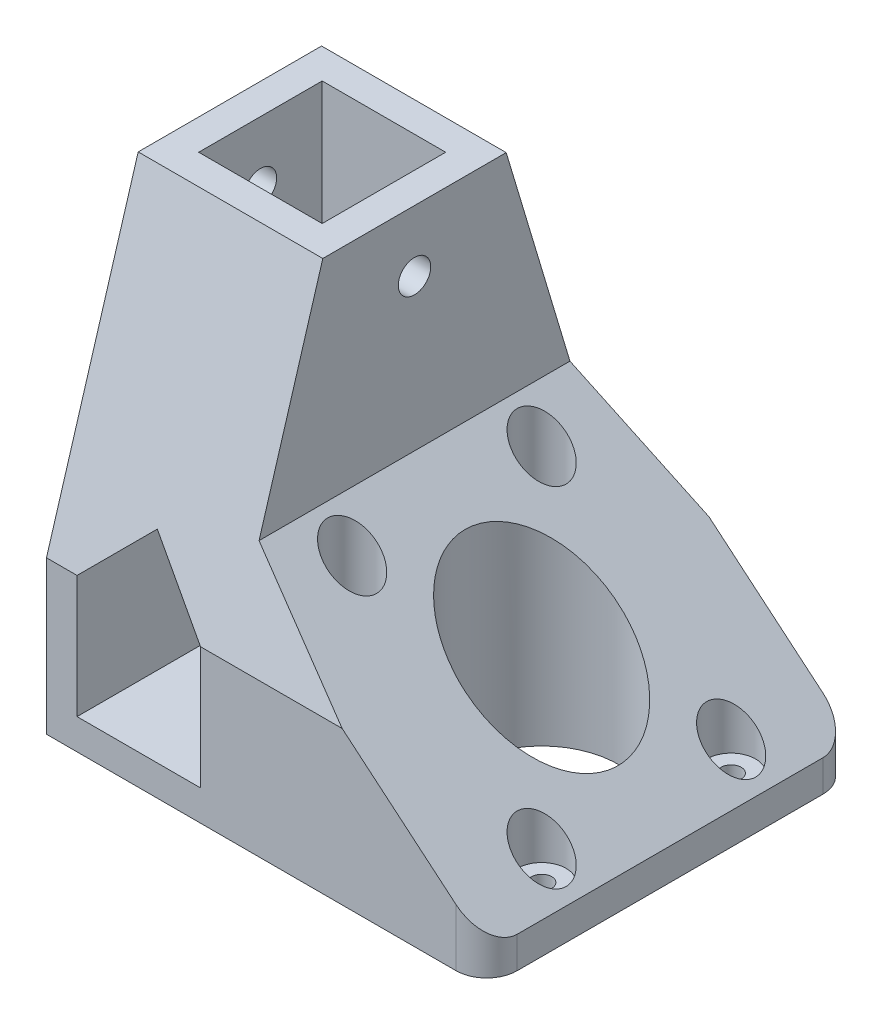
ISO-10303-21;
HEADER;
FILE_DESCRIPTION(('STEP AP214'),'2;1');
FILE_NAME('part.step','',(''),(''),'','','');
FILE_SCHEMA(('AUTOMOTIVE_DESIGN { 1 0 10303 214 1 1 1 1 }'));
ENDSEC;
DATA;
#1=APPLICATION_CONTEXT('core data for automotive mechanical design processes');
#2=APPLICATION_PROTOCOL_DEFINITION('international standard','automotive_design',2000,#1);
#3=PRODUCT_CONTEXT('',#1,'mechanical');
#4=PRODUCT('Part','Part','',(#3));
#5=PRODUCT_RELATED_PRODUCT_CATEGORY('part','',(#4));
#6=PRODUCT_DEFINITION_FORMATION('','',#4);
#7=PRODUCT_DEFINITION_CONTEXT('part definition',#1,'design');
#8=PRODUCT_DEFINITION('design','',#6,#7);
#9=PRODUCT_DEFINITION_SHAPE('','',#8);
#10=(LENGTH_UNIT() NAMED_UNIT(*) SI_UNIT(.MILLI.,.METRE.));
#11=(NAMED_UNIT(*) PLANE_ANGLE_UNIT() SI_UNIT($,.RADIAN.));
#12=(NAMED_UNIT(*) SI_UNIT($,.STERADIAN.) SOLID_ANGLE_UNIT());
#13=UNCERTAINTY_MEASURE_WITH_UNIT(LENGTH_MEASURE(1.E-05),#10,'distance_accuracy_value','');
#14=(GEOMETRIC_REPRESENTATION_CONTEXT(3) GLOBAL_UNCERTAINTY_ASSIGNED_CONTEXT((#13)) GLOBAL_UNIT_ASSIGNED_CONTEXT((#10,
#11,#12)) REPRESENTATION_CONTEXT('',''));
#15=CARTESIAN_POINT('',(0.,0.,0.));
#16=DIRECTION('',(0.,0.,1.));
#17=DIRECTION('',(1.,0.,0.));
#18=AXIS2_PLACEMENT_3D('',#15,#16,#17);
#19=CARTESIAN_POINT('',(66.5,75.,-14.5));
#20=DIRECTION('',(0.,-1.,0.));
#21=DIRECTION('',(0.,0.,-1.));
#22=AXIS2_PLACEMENT_3D('',#19,#20,#21);
#23=CYLINDRICAL_SURFACE('',#22,1.65);
#24=CARTESIAN_POINT('',(66.5,0.,-14.5));
#25=DIRECTION('',(0.,-1.,0.));
#26=DIRECTION('',(0.,0.,-1.));
#27=AXIS2_PLACEMENT_3D('',#24,#25,#26);
#28=CIRCLE('',#27,1.65);
#29=CARTESIAN_POINT('',(66.5,0.,-16.15));
#30=VERTEX_POINT('',#29);
#31=EDGE_CURVE('E526',#30,#30,#28,.T.);
#32=ORIENTED_EDGE('',*,*,#31,.T.);
#33=EDGE_LOOP('',(#32));
#34=FACE_BOUND('',#33,.T.);
#35=CARTESIAN_POINT('',(66.5,5.,-14.5));
#36=DIRECTION('',(0.,1.,0.));
#37=DIRECTION('',(0.,0.,1.));
#38=AXIS2_PLACEMENT_3D('',#35,#36,#37);
#39=CIRCLE('',#38,1.65);
#40=CARTESIAN_POINT('',(66.5,5.,-12.85));
#41=VERTEX_POINT('',#40);
#42=EDGE_CURVE('E391',#41,#41,#39,.F.);
#43=ORIENTED_EDGE('',*,*,#42,.F.);
#44=EDGE_LOOP('',(#43));
#45=FACE_BOUND('',#44,.T.);
#46=ADVANCED_FACE('F40',(#34,#45),#23,.F.);
#47=CARTESIAN_POINT('',(66.5,75.,-45.5));
#48=DIRECTION('',(0.,-1.,0.));
#49=DIRECTION('',(0.,0.,-1.));
#50=AXIS2_PLACEMENT_3D('',#47,#48,#49);
#51=CYLINDRICAL_SURFACE('',#50,1.65);
#52=CARTESIAN_POINT('',(66.5,0.,-45.5));
#53=DIRECTION('',(0.,-1.,0.));
#54=DIRECTION('',(0.,0.,-1.));
#55=AXIS2_PLACEMENT_3D('',#52,#53,#54);
#56=CIRCLE('',#55,1.65);
#57=CARTESIAN_POINT('',(66.5,0.,-47.15));
#58=VERTEX_POINT('',#57);
#59=EDGE_CURVE('E530',#58,#58,#56,.T.);
#60=ORIENTED_EDGE('',*,*,#59,.T.);
#61=EDGE_LOOP('',(#60));
#62=FACE_BOUND('',#61,.T.);
#63=CARTESIAN_POINT('',(66.5,5.,-45.5));
#64=DIRECTION('',(0.,1.,0.));
#65=DIRECTION('',(0.,0.,1.));
#66=AXIS2_PLACEMENT_3D('',#63,#64,#65);
#67=CIRCLE('',#66,1.65);
#68=CARTESIAN_POINT('',(66.5,5.,-43.85));
#69=VERTEX_POINT('',#68);
#70=EDGE_CURVE('E387',#69,#69,#67,.F.);
#71=ORIENTED_EDGE('',*,*,#70,.F.);
#72=EDGE_LOOP('',(#71));
#73=FACE_BOUND('',#72,.T.);
#74=ADVANCED_FACE('F588',(#62,#73),#51,.F.);
#75=CARTESIAN_POINT('',(35.5,75.,-45.5));
#76=DIRECTION('',(0.,-1.,0.));
#77=DIRECTION('',(0.,0.,-1.));
#78=AXIS2_PLACEMENT_3D('',#75,#76,#77);
#79=CYLINDRICAL_SURFACE('',#78,1.65);
#80=CARTESIAN_POINT('',(35.5,0.,-45.5));
#81=DIRECTION('',(0.,-1.,0.));
#82=DIRECTION('',(0.,0.,-1.));
#83=AXIS2_PLACEMENT_3D('',#80,#81,#82);
#84=CIRCLE('',#83,1.65);
#85=CARTESIAN_POINT('',(35.5,0.,-47.15));
#86=VERTEX_POINT('',#85);
#87=EDGE_CURVE('E534',#86,#86,#84,.T.);
#88=ORIENTED_EDGE('',*,*,#87,.T.);
#89=EDGE_LOOP('',(#88));
#90=FACE_BOUND('',#89,.T.);
#91=CARTESIAN_POINT('',(35.5,5.,-45.5));
#92=DIRECTION('',(0.,1.,0.));
#93=DIRECTION('',(0.,0.,1.));
#94=AXIS2_PLACEMENT_3D('',#91,#92,#93);
#95=CIRCLE('',#94,1.65);
#96=CARTESIAN_POINT('',(35.5,5.,-43.85));
#97=VERTEX_POINT('',#96);
#98=EDGE_CURVE('E382',#97,#97,#95,.F.);
#99=ORIENTED_EDGE('',*,*,#98,.F.);
#100=EDGE_LOOP('',(#99));
#101=FACE_BOUND('',#100,.T.);
#102=ADVANCED_FACE('F594',(#90,#101),#79,.F.);
#103=CARTESIAN_POINT('',(35.5,75.,-14.5));
#104=DIRECTION('',(0.,-1.,0.));
#105=DIRECTION('',(0.,0.,-1.));
#106=AXIS2_PLACEMENT_3D('',#103,#104,#105);
#107=CYLINDRICAL_SURFACE('',#106,1.65);
#108=CARTESIAN_POINT('',(35.5,0.,-14.5));
#109=DIRECTION('',(0.,-1.,0.));
#110=DIRECTION('',(0.,0.,-1.));
#111=AXIS2_PLACEMENT_3D('',#108,#109,#110);
#112=CIRCLE('',#111,1.65);
#113=CARTESIAN_POINT('',(35.5,0.,-16.15));
#114=VERTEX_POINT('',#113);
#115=EDGE_CURVE('E411',#114,#114,#112,.T.);
#116=ORIENTED_EDGE('',*,*,#115,.T.);
#117=EDGE_LOOP('',(#116));
#118=FACE_BOUND('',#117,.T.);
#119=CARTESIAN_POINT('',(35.5,5.,-14.5));
#120=DIRECTION('',(0.,1.,0.));
#121=DIRECTION('',(0.,0.,1.));
#122=AXIS2_PLACEMENT_3D('',#119,#120,#121);
#123=CIRCLE('',#122,1.65);
#124=CARTESIAN_POINT('',(35.5,5.,-12.85));
#125=VERTEX_POINT('',#124);
#126=EDGE_CURVE('E378',#125,#125,#123,.F.);
#127=ORIENTED_EDGE('',*,*,#126,.F.);
#128=EDGE_LOOP('',(#127));
#129=FACE_BOUND('',#128,.T.);
#130=ADVANCED_FACE('F600',(#118,#129),#107,.F.);
#131=CARTESIAN_POINT('',(15.1,35.1000000000001,53.9262459290465));
#132=DIRECTION('',(0.707106781186551,-0.707106781186544,0.));
#133=DIRECTION('',(0.707106781186544,0.707106781186551,0.));
#134=AXIS2_PLACEMENT_3D('',#131,#132,#133);
#135=PLANE('',#134);
#136=DIRECTION('',(-0.707106781186544,-0.707106781186551,0.));
#137=VECTOR('',#136,1.);
#138=CARTESIAN_POINT('',(15.1,35.1000000000001,-19.9));
#139=LINE('',#138,#137);
#140=CARTESIAN_POINT('',(15.1,35.1000000000001,-19.9));
#141=VERTEX_POINT('',#140);
#142=CARTESIAN_POINT('',(5.,25.,-19.9));
#143=VERTEX_POINT('',#142);
#144=EDGE_CURVE('E224',#141,#143,#139,.T.);
#145=ORIENTED_EDGE('',*,*,#144,.F.);
#146=DIRECTION('',(0.,0.,-1.));
#147=VECTOR('',#146,1.);
#148=CARTESIAN_POINT('',(15.1,35.1000000000001,53.9262459290465));
#149=LINE('',#148,#147);
#150=CARTESIAN_POINT('',(15.1,35.1000000000001,-3.03014521594729));
#151=VERTEX_POINT('',#150);
#152=EDGE_CURVE('E233',#151,#141,#149,.T.);
#153=ORIENTED_EDGE('',*,*,#152,.F.);
#154=DIRECTION('',(-0.691713036274989,-0.691713036274996,0.207523856205644));
#155=VECTOR('',#154,1.);
#156=CARTESIAN_POINT('',(6.92408338791671,26.9240833879167,-0.577252680493051));
#157=LINE('',#156,#155);
#158=CARTESIAN_POINT('',(5.,25.,0.));
#159=VERTEX_POINT('',#158);
#160=EDGE_CURVE('E333',#151,#159,#157,.T.);
#161=ORIENTED_EDGE('',*,*,#160,.T.);
#162=DIRECTION('',(0.,0.,-1.));
#163=VECTOR('',#162,1.);
#164=CARTESIAN_POINT('',(5.,25.,53.9262459290465));
#165=LINE('',#164,#163);
#166=EDGE_CURVE('E228',#159,#143,#165,.T.);
#167=ORIENTED_EDGE('',*,*,#166,.T.);
#168=EDGE_LOOP('',(#145,#153,#161,#167));
#169=FACE_BOUND('',#168,.T.);
#170=ADVANCED_FACE('F517',(#169),#135,.T.);
#171=CARTESIAN_POINT('',(25.2,25.,53.9262459290465));
#172=DIRECTION('',(-0.707106781186551,-0.707106781186544,0.));
#173=DIRECTION('',(0.707106781186544,-0.707106781186551,0.));
#174=AXIS2_PLACEMENT_3D('',#171,#172,#173);
#175=PLANE('',#174);
#176=DIRECTION('',(-0.707106781186544,0.707106781186551,0.));
#177=VECTOR('',#176,1.);
#178=CARTESIAN_POINT('',(25.2,25.,-19.9));
#179=LINE('',#178,#177);
#180=CARTESIAN_POINT('',(25.2,25.,-19.9));
#181=VERTEX_POINT('',#180);
#182=EDGE_CURVE('E369',#181,#141,#179,.T.);
#183=ORIENTED_EDGE('',*,*,#182,.F.);
#184=DIRECTION('',(0.,0.,-1.));
#185=VECTOR('',#184,1.);
#186=CARTESIAN_POINT('',(25.2,25.,53.9262459290465));
#187=LINE('',#186,#185);
#188=CARTESIAN_POINT('',(25.2,25.,0.));
#189=VERTEX_POINT('',#188);
#190=EDGE_CURVE('E238',#189,#181,#187,.T.);
#191=ORIENTED_EDGE('',*,*,#190,.F.);
#192=DIRECTION('',(-0.691713036274989,0.691713036274997,-0.207523856205645));
#193=VECTOR('',#192,1.);
#194=CARTESIAN_POINT('',(32.9409484880492,17.2590515119507,2.32239584435209));
#195=LINE('',#194,#193);
#196=EDGE_CURVE('E340',#189,#151,#195,.T.);
#197=ORIENTED_EDGE('',*,*,#196,.T.);
#198=ORIENTED_EDGE('',*,*,#152,.T.);
#199=EDGE_LOOP('',(#183,#191,#197,#198));
#200=FACE_BOUND('',#199,.T.);
#201=ADVANCED_FACE('F514',(#200),#175,.T.);
#202=CARTESIAN_POINT('',(0.,5.,0.));
#203=DIRECTION('',(0.,-1.,0.));
#204=DIRECTION('',(0.,0.,-1.));
#205=AXIS2_PLACEMENT_3D('',#202,#203,#204);
#206=PLANE('',#205);
#207=CARTESIAN_POINT('',(15.,5.,-30.));
#208=DIRECTION('',(0.,-1.,0.));
#209=DIRECTION('',(0.,0.,-1.));
#210=AXIS2_PLACEMENT_3D('',#207,#208,#209);
#211=CIRCLE('',#210,2.65);
#212=CARTESIAN_POINT('',(15.,5.,-32.65));
#213=VERTEX_POINT('',#212);
#214=EDGE_CURVE('E422',#213,#213,#211,.T.);
#215=ORIENTED_EDGE('',*,*,#214,.T.);
#216=EDGE_LOOP('',(#215));
#217=FACE_BOUND('',#216,.T.);
#218=DIRECTION('',(0.,0.,1.));
#219=VECTOR('',#218,1.);
#220=CARTESIAN_POINT('',(25.2,5.,-60.));
#221=LINE('',#220,#219);
#222=CARTESIAN_POINT('',(25.2,5.,-60.));
#223=VERTEX_POINT('',#222);
#224=CARTESIAN_POINT('',(25.2,5.,0.));
#225=VERTEX_POINT('',#224);
#226=EDGE_CURVE('E232',#223,#225,#221,.T.);
#227=ORIENTED_EDGE('',*,*,#226,.F.);
#228=DIRECTION('',(-1.,0.,0.));
#229=VECTOR('',#228,1.);
#230=CARTESIAN_POINT('',(0.,5.,-60.));
#231=LINE('',#230,#229);
#232=CARTESIAN_POINT('',(5.,5.,-60.));
#233=VERTEX_POINT('',#232);
#234=EDGE_CURVE('E274',#223,#233,#231,.T.);
#235=ORIENTED_EDGE('',*,*,#234,.T.);
#236=DIRECTION('',(0.,0.,-1.));
#237=VECTOR('',#236,1.);
#238=CARTESIAN_POINT('',(5.,5.,-60.));
#239=LINE('',#238,#237);
#240=CARTESIAN_POINT('',(4.99999999999999,5.,0.));
#241=VERTEX_POINT('',#240);
#242=EDGE_CURVE('E255',#241,#233,#239,.T.);
#243=ORIENTED_EDGE('',*,*,#242,.F.);
#244=DIRECTION('',(1.,0.,0.));
#245=VECTOR('',#244,1.);
#246=CARTESIAN_POINT('',(0.,5.,0.));
#247=LINE('',#246,#245);
#248=EDGE_CURVE('E270',#241,#225,#247,.T.);
#249=ORIENTED_EDGE('',*,*,#248,.T.);
#250=EDGE_LOOP('',(#227,#235,#243,#249));
#251=FACE_BOUND('',#250,.T.);
#252=ADVANCED_FACE('F506',(#217,#251),#206,.F.);
#253=CARTESIAN_POINT('',(0.,5.,0.));
#254=DIRECTION('',(1.,0.,0.));
#255=DIRECTION('',(0.,0.,-1.));
#256=AXIS2_PLACEMENT_3D('',#253,#254,#255);
#257=PLANE('',#256);
#258=CARTESIAN_POINT('',(0.,15.,-30.));
#259=DIRECTION('',(-1.,0.,0.));
#260=DIRECTION('',(0.,0.,1.));
#261=AXIS2_PLACEMENT_3D('',#258,#259,#260);
#262=CIRCLE('',#261,2.65);
#263=CARTESIAN_POINT('',(0.,15.,-27.35));
#264=VERTEX_POINT('',#263);
#265=EDGE_CURVE('E569',#264,#264,#262,.T.);
#266=ORIENTED_EDGE('',*,*,#265,.F.);
#267=EDGE_LOOP('',(#266));
#268=FACE_BOUND('',#267,.T.);
#269=CARTESIAN_POINT('',(0.,65.,-30.));
#270=DIRECTION('',(1.,0.,0.));
#271=DIRECTION('',(0.,0.,-1.));
#272=AXIS2_PLACEMENT_3D('',#269,#270,#271);
#273=CIRCLE('',#272,2.65);
#274=CARTESIAN_POINT('',(0.,65.,-32.65));
#275=VERTEX_POINT('',#274);
#276=EDGE_CURVE('E417',#275,#275,#273,.T.);
#277=ORIENTED_EDGE('',*,*,#276,.T.);
#278=EDGE_LOOP('',(#277));
#279=FACE_BOUND('',#278,.T.);
#280=DIRECTION('',(0.,0.,1.));
#281=VECTOR('',#280,1.);
#282=CARTESIAN_POINT('',(0.,75.,-60.));
#283=LINE('',#282,#281);
#284=CARTESIAN_POINT('',(0.,75.,-44.9992811091721));
#285=VERTEX_POINT('',#284);
#286=CARTESIAN_POINT('',(0.,75.,-15.0007188908279));
#287=VERTEX_POINT('',#286);
#288=EDGE_CURVE('E256',#285,#287,#283,.T.);
#289=ORIENTED_EDGE('',*,*,#288,.F.);
#290=DIRECTION('',(0.,-0.957822494845313,-0.287360519849719));
#291=VECTOR('',#290,1.);
#292=CARTESIAN_POINT('',(0.,75.,-44.9992811091721));
#293=LINE('',#292,#291);
#294=CARTESIAN_POINT('',(0.,24.9999999999999,-60.));
#295=VERTEX_POINT('',#294);
#296=EDGE_CURVE('E323',#285,#295,#293,.T.);
#297=ORIENTED_EDGE('',*,*,#296,.T.);
#298=DIRECTION('',(0.,-1.,0.));
#299=VECTOR('',#298,1.);
#300=CARTESIAN_POINT('',(0.,5.,-60.));
#301=LINE('',#300,#299);
#302=CARTESIAN_POINT('',(0.,0.,-60.));
#303=VERTEX_POINT('',#302);
#304=EDGE_CURVE('E279',#295,#303,#301,.T.);
#305=ORIENTED_EDGE('',*,*,#304,.T.);
#306=DIRECTION('',(0.,0.,1.));
#307=VECTOR('',#306,1.);
#308=CARTESIAN_POINT('',(0.,0.,0.));
#309=LINE('',#308,#307);
#310=CARTESIAN_POINT('',(0.,0.,0.));
#311=VERTEX_POINT('',#310);
#312=EDGE_CURVE('E269',#303,#311,#309,.T.);
#313=ORIENTED_EDGE('',*,*,#312,.T.);
#314=DIRECTION('',(0.,-1.,0.));
#315=VECTOR('',#314,1.);
#316=CARTESIAN_POINT('',(0.,5.,0.));
#317=LINE('',#316,#315);
#318=CARTESIAN_POINT('',(0.,24.9999999999999,0.));
#319=VERTEX_POINT('',#318);
#320=EDGE_CURVE('E295',#319,#311,#317,.T.);
#321=ORIENTED_EDGE('',*,*,#320,.F.);
#322=DIRECTION('',(0.,0.957822494845313,-0.287360519849719));
#323=VECTOR('',#322,1.);
#324=CARTESIAN_POINT('',(0.,75.,-15.0007188908279));
#325=LINE('',#324,#323);
#326=EDGE_CURVE('E320',#319,#287,#325,.T.);
#327=ORIENTED_EDGE('',*,*,#326,.T.);
#328=EDGE_LOOP('',(#289,#297,#305,#313,#321,#327));
#329=FACE_BOUND('',#328,.T.);
#330=ADVANCED_FACE('F471',(#268,#279,#329),#257,.F.);
#331=CARTESIAN_POINT('',(0.,5.,0.));
#332=DIRECTION('',(0.,0.,-1.));
#333=DIRECTION('',(-1.,0.,0.));
#334=AXIS2_PLACEMENT_3D('',#331,#332,#333);
#335=PLANE('',#334);
#336=DIRECTION('',(1.,0.,0.));
#337=VECTOR('',#336,1.);
#338=CARTESIAN_POINT('',(0.,0.,0.));
#339=LINE('',#338,#337);
#340=CARTESIAN_POINT('',(67.,0.,0.));
#341=VERTEX_POINT('',#340);
#342=EDGE_CURVE('E283',#311,#341,#339,.T.);
#343=ORIENTED_EDGE('',*,*,#342,.T.);
#344=DIRECTION('',(0.,-1.,0.));
#345=VECTOR('',#344,1.);
#346=CARTESIAN_POINT('',(67.,5.,0.));
#347=LINE('',#346,#345);
#348=CARTESIAN_POINT('',(67.,9.36331808212209,0.));
#349=VERTEX_POINT('',#348);
#350=EDGE_CURVE('E12',#341,#349,#347,.F.);
#351=ORIENTED_EDGE('',*,*,#350,.T.);
#352=DIRECTION('',(0.766044443118974,-0.642787609686544,0.));
#353=VECTOR('',#352,1.);
#354=CARTESIAN_POINT('',(29.8313007862243,40.5515598837409,0.));
#355=LINE('',#354,#353);
#356=CARTESIAN_POINT('',(48.3649281481164,24.9999999999999,0.));
#357=VERTEX_POINT('',#356);
#358=EDGE_CURVE('E309',#349,#357,#355,.F.);
#359=ORIENTED_EDGE('',*,*,#358,.T.);
#360=DIRECTION('',(-1.,0.,0.));
#361=VECTOR('',#360,1.);
#362=CARTESIAN_POINT('',(0.,24.9999999999999,0.));
#363=LINE('',#362,#361);
#364=EDGE_CURVE('E363',#357,#189,#363,.T.);
#365=ORIENTED_EDGE('',*,*,#364,.T.);
#366=DIRECTION('',(0.,-1.,0.));
#367=VECTOR('',#366,1.);
#368=CARTESIAN_POINT('',(25.2,75.,0.));
#369=LINE('',#368,#367);
#370=EDGE_CURVE('E252',#189,#225,#369,.T.);
#371=ORIENTED_EDGE('',*,*,#370,.T.);
#372=ORIENTED_EDGE('',*,*,#248,.F.);
#373=DIRECTION('',(0.,-1.,0.));
#374=VECTOR('',#373,1.);
#375=CARTESIAN_POINT('',(4.99999999999998,75.,0.));
#376=LINE('',#375,#374);
#377=EDGE_CURVE('E266',#159,#241,#376,.T.);
#378=ORIENTED_EDGE('',*,*,#377,.F.);
#379=DIRECTION('',(-1.,0.,0.));
#380=VECTOR('',#379,1.);
#381=CARTESIAN_POINT('',(0.,24.9999999999999,0.));
#382=LINE('',#381,#380);
#383=EDGE_CURVE('E360',#159,#319,#382,.T.);
#384=ORIENTED_EDGE('',*,*,#383,.T.);
#385=ORIENTED_EDGE('',*,*,#320,.T.);
#386=EDGE_LOOP('',(#343,#351,#359,#365,#371,#372,#378,#384,#385));
#387=FACE_BOUND('',#386,.T.);
#388=ADVANCED_FACE('F464',(#387),#335,.F.);
#389=CARTESIAN_POINT('',(72.,5.,0.));
#390=DIRECTION('',(-1.,0.,0.));
#391=DIRECTION('',(0.,0.,1.));
#392=AXIS2_PLACEMENT_3D('',#389,#390,#391);
#393=PLANE('',#392);
#394=DIRECTION('',(0.,0.,-1.));
#395=VECTOR('',#394,1.);
#396=CARTESIAN_POINT('',(72.,0.,0.));
#397=LINE('',#396,#395);
#398=CARTESIAN_POINT('',(72.,0.,-5.));
#399=VERTEX_POINT('',#398);
#400=CARTESIAN_POINT('',(72.,0.,-55.));
#401=VERTEX_POINT('',#400);
#402=EDGE_CURVE('E286',#399,#401,#397,.T.);
#403=ORIENTED_EDGE('',*,*,#402,.T.);
#404=DIRECTION('',(0.,-1.,0.));
#405=VECTOR('',#404,1.);
#406=CARTESIAN_POINT('',(72.,5.,-55.));
#407=LINE('',#406,#405);
#408=CARTESIAN_POINT('',(72.,5.16781992623565,-55.));
#409=VERTEX_POINT('',#408);
#410=EDGE_CURVE('E436',#401,#409,#407,.F.);
#411=ORIENTED_EDGE('',*,*,#410,.T.);
#412=DIRECTION('',(0.,0.,-1.));
#413=VECTOR('',#412,1.);
#414=CARTESIAN_POINT('',(72.,5.16781992623564,0.));
#415=LINE('',#414,#413);
#416=CARTESIAN_POINT('',(72.,5.16781992623564,-5.));
#417=VERTEX_POINT('',#416);
#418=EDGE_CURVE('E306',#409,#417,#415,.F.);
#419=ORIENTED_EDGE('',*,*,#418,.T.);
#420=DIRECTION('',(0.,-1.,0.));
#421=VECTOR('',#420,1.);
#422=CARTESIAN_POINT('',(72.,5.,-5.));
#423=LINE('',#422,#421);
#424=EDGE_CURVE('E432',#417,#399,#423,.T.);
#425=ORIENTED_EDGE('',*,*,#424,.T.);
#426=EDGE_LOOP('',(#403,#411,#419,#425));
#427=FACE_BOUND('',#426,.T.);
#428=ADVANCED_FACE('F460',(#427),#393,.F.);
#429=CARTESIAN_POINT('',(0.,5.,-60.));
#430=DIRECTION('',(0.,0.,1.));
#431=DIRECTION('',(1.,0.,0.));
#432=AXIS2_PLACEMENT_3D('',#429,#430,#431);
#433=PLANE('',#432);
#434=DIRECTION('',(-0.766044443118974,0.642787609686544,0.));
#435=VECTOR('',#434,1.);
#436=CARTESIAN_POINT('',(29.8313007862243,40.5515598837409,-60.));
#437=LINE('',#436,#435);
#438=CARTESIAN_POINT('',(48.3649281481164,24.9999999999999,-60.));
#439=VERTEX_POINT('',#438);
#440=CARTESIAN_POINT('',(67.,9.36331808212211,-60.));
#441=VERTEX_POINT('',#440);
#442=EDGE_CURVE('E302',#439,#441,#437,.F.);
#443=ORIENTED_EDGE('',*,*,#442,.T.);
#444=DIRECTION('',(0.,-1.,0.));
#445=VECTOR('',#444,1.);
#446=CARTESIAN_POINT('',(67.,5.,-60.));
#447=LINE('',#446,#445);
#448=CARTESIAN_POINT('',(67.,0.,-60.));
#449=VERTEX_POINT('',#448);
#450=EDGE_CURVE('E372',#441,#449,#447,.T.);
#451=ORIENTED_EDGE('',*,*,#450,.T.);
#452=DIRECTION('',(-1.,0.,0.));
#453=VECTOR('',#452,1.);
#454=CARTESIAN_POINT('',(0.,0.,-60.));
#455=LINE('',#454,#453);
#456=EDGE_CURVE('E275',#449,#303,#455,.T.);
#457=ORIENTED_EDGE('',*,*,#456,.T.);
#458=ORIENTED_EDGE('',*,*,#304,.F.);
#459=DIRECTION('',(1.,0.,0.));
#460=VECTOR('',#459,1.);
#461=CARTESIAN_POINT('',(30.2,24.9999999999999,-60.));
#462=LINE('',#461,#460);
#463=CARTESIAN_POINT('',(5.,25.,-60.));
#464=VERTEX_POINT('',#463);
#465=EDGE_CURVE('E329',#295,#464,#462,.T.);
#466=ORIENTED_EDGE('',*,*,#465,.T.);
#467=DIRECTION('',(0.,-1.,0.));
#468=VECTOR('',#467,1.);
#469=CARTESIAN_POINT('',(5.,75.,-60.));
#470=LINE('',#469,#468);
#471=EDGE_CURVE('E260',#464,#233,#470,.T.);
#472=ORIENTED_EDGE('',*,*,#471,.T.);
#473=ORIENTED_EDGE('',*,*,#234,.F.);
#474=DIRECTION('',(0.,-1.,0.));
#475=VECTOR('',#474,1.);
#476=CARTESIAN_POINT('',(25.2,75.,-60.));
#477=LINE('',#476,#475);
#478=CARTESIAN_POINT('',(25.2,25.,-60.));
#479=VERTEX_POINT('',#478);
#480=EDGE_CURVE('E246',#479,#223,#477,.T.);
#481=ORIENTED_EDGE('',*,*,#480,.F.);
#482=DIRECTION('',(1.,0.,0.));
#483=VECTOR('',#482,1.);
#484=CARTESIAN_POINT('',(30.2,24.9999999999999,-60.));
#485=LINE('',#484,#483);
#486=EDGE_CURVE('E326',#479,#439,#485,.T.);
#487=ORIENTED_EDGE('',*,*,#486,.T.);
#488=EDGE_LOOP('',(#443,#451,#457,#458,#466,#472,#473,#481,#487));
#489=FACE_BOUND('',#488,.T.);
#490=ADVANCED_FACE('F450',(#489),#433,.F.);
#491=CARTESIAN_POINT('',(0.,0.,0.));
#492=DIRECTION('',(0.,-1.,0.));
#493=DIRECTION('',(0.,0.,-1.));
#494=AXIS2_PLACEMENT_3D('',#491,#492,#493);
#495=PLANE('',#494);
#496=CARTESIAN_POINT('',(15.,0.,-30.));
#497=DIRECTION('',(0.,-1.,0.));
#498=DIRECTION('',(0.,0.,-1.));
#499=AXIS2_PLACEMENT_3D('',#496,#497,#498);
#500=CIRCLE('',#499,2.65);
#501=CARTESIAN_POINT('',(15.,0.,-32.65));
#502=VERTEX_POINT('',#501);
#503=EDGE_CURVE('E418',#502,#502,#500,.T.);
#504=ORIENTED_EDGE('',*,*,#503,.F.);
#505=EDGE_LOOP('',(#504));
#506=FACE_BOUND('',#505,.T.);
#507=ORIENTED_EDGE('',*,*,#115,.F.);
#508=EDGE_LOOP('',(#507));
#509=FACE_BOUND('',#508,.T.);
#510=ORIENTED_EDGE('',*,*,#87,.F.);
#511=EDGE_LOOP('',(#510));
#512=FACE_BOUND('',#511,.T.);
#513=ORIENTED_EDGE('',*,*,#59,.F.);
#514=EDGE_LOOP('',(#513));
#515=FACE_BOUND('',#514,.T.);
#516=ORIENTED_EDGE('',*,*,#31,.F.);
#517=EDGE_LOOP('',(#516));
#518=FACE_BOUND('',#517,.T.);
#519=CARTESIAN_POINT('',(51.,0.,-30.));
#520=DIRECTION('',(0.,1.,0.));
#521=DIRECTION('',(0.,0.,1.));
#522=AXIS2_PLACEMENT_3D('',#519,#520,#521);
#523=CIRCLE('',#522,12.5);
#524=CARTESIAN_POINT('',(51.,0.,-17.5));
#525=VERTEX_POINT('',#524);
#526=EDGE_CURVE('E377',#525,#525,#523,.T.);
#527=ORIENTED_EDGE('',*,*,#526,.T.);
#528=EDGE_LOOP('',(#527));
#529=FACE_BOUND('',#528,.T.);
#530=ORIENTED_EDGE('',*,*,#456,.F.);
#531=CARTESIAN_POINT('',(67.,0.,-55.));
#532=DIRECTION('',(0.,-1.,0.));
#533=DIRECTION('',(0.,0.,-1.));
#534=AXIS2_PLACEMENT_3D('',#531,#532,#533);
#535=CIRCLE('',#534,5.);
#536=EDGE_CURVE('E429',#449,#401,#535,.T.);
#537=ORIENTED_EDGE('',*,*,#536,.T.);
#538=ORIENTED_EDGE('',*,*,#402,.F.);
#539=CARTESIAN_POINT('',(67.,0.,-5.));
#540=DIRECTION('',(0.,-1.,0.));
#541=DIRECTION('',(0.,0.,-1.));
#542=AXIS2_PLACEMENT_3D('',#539,#540,#541);
#543=CIRCLE('',#542,5.);
#544=EDGE_CURVE('E426',#399,#341,#543,.T.);
#545=ORIENTED_EDGE('',*,*,#544,.T.);
#546=ORIENTED_EDGE('',*,*,#342,.F.);
#547=ORIENTED_EDGE('',*,*,#312,.F.);
#548=EDGE_LOOP('',(#530,#537,#538,#545,#546,#547));
#549=FACE_BOUND('',#548,.T.);
#550=ADVANCED_FACE('F457',(#506,#509,#512,#515,#518,#529,#549),#495,.T.);
#551=CARTESIAN_POINT('',(5.,75.,-60.));
#552=DIRECTION('',(-1.,0.,0.));
#553=DIRECTION('',(0.,0.,1.));
#554=AXIS2_PLACEMENT_3D('',#551,#552,#553);
#555=PLANE('',#554);
#556=CARTESIAN_POINT('',(4.99999999999999,15.,-30.));
#557=DIRECTION('',(-1.,0.,0.));
#558=DIRECTION('',(0.,0.,1.));
#559=AXIS2_PLACEMENT_3D('',#556,#557,#558);
#560=CIRCLE('',#559,2.65);
#561=CARTESIAN_POINT('',(4.99999999999999,15.,-27.35));
#562=VERTEX_POINT('',#561);
#563=EDGE_CURVE('E44',#562,#562,#560,.T.);
#564=ORIENTED_EDGE('',*,*,#563,.T.);
#565=EDGE_LOOP('',(#564));
#566=FACE_BOUND('',#565,.T.);
#567=CARTESIAN_POINT('',(4.99999999999999,65.,-30.));
#568=DIRECTION('',(-1.,0.,0.));
#569=DIRECTION('',(0.,0.,1.));
#570=AXIS2_PLACEMENT_3D('',#567,#568,#569);
#571=CIRCLE('',#570,2.65);
#572=CARTESIAN_POINT('',(4.99999999999999,65.,-27.35));
#573=VERTEX_POINT('',#572);
#574=EDGE_CURVE('E550',#573,#573,#571,.T.);
#575=ORIENTED_EDGE('',*,*,#574,.T.);
#576=EDGE_LOOP('',(#575));
#577=FACE_BOUND('',#576,.T.);
#578=DIRECTION('',(0.,1.,0.));
#579=VECTOR('',#578,1.);
#580=CARTESIAN_POINT('',(5.,7.99999999999998,-19.9));
#581=LINE('',#580,#579);
#582=CARTESIAN_POINT('',(5.,75.,-19.9));
#583=VERTEX_POINT('',#582);
#584=EDGE_CURVE('E191',#143,#583,#581,.T.);
#585=ORIENTED_EDGE('',*,*,#584,.F.);
#586=ORIENTED_EDGE('',*,*,#166,.F.);
#587=ORIENTED_EDGE('',*,*,#377,.T.);
#588=ORIENTED_EDGE('',*,*,#242,.T.);
#589=ORIENTED_EDGE('',*,*,#471,.F.);
#590=CARTESIAN_POINT('',(5.,25.,-40.1));
#591=VERTEX_POINT('',#590);
#592=EDGE_CURVE('E187',#591,#464,#165,.T.);
#593=ORIENTED_EDGE('',*,*,#592,.F.);
#594=DIRECTION('',(0.,1.,0.));
#595=VECTOR('',#594,1.);
#596=CARTESIAN_POINT('',(5.,7.99999999999998,-40.1));
#597=LINE('',#596,#595);
#598=CARTESIAN_POINT('',(5.,75.,-40.1));
#599=VERTEX_POINT('',#598);
#600=EDGE_CURVE('E179',#591,#599,#597,.T.);
#601=ORIENTED_EDGE('',*,*,#600,.T.);
#602=DIRECTION('',(0.,0.,1.));
#603=VECTOR('',#602,1.);
#604=CARTESIAN_POINT('',(5.,75.,-40.1));
#605=LINE('',#604,#603);
#606=EDGE_CURVE('E184',#599,#583,#605,.T.);
#607=ORIENTED_EDGE('',*,*,#606,.T.);
#608=EDGE_LOOP('',(#585,#586,#587,#588,#589,#593,#601,#607));
#609=FACE_BOUND('',#608,.T.);
#610=ADVANCED_FACE('F182',(#566,#577,#609),#555,.F.);
#611=CARTESIAN_POINT('',(0.,75.,0.));
#612=DIRECTION('',(0.,1.,0.));
#613=DIRECTION('',(0.,0.,1.));
#614=AXIS2_PLACEMENT_3D('',#611,#612,#613);
#615=PLANE('',#614);
#616=DIRECTION('',(0.,0.,-1.));
#617=VECTOR('',#616,1.);
#618=CARTESIAN_POINT('',(25.2,75.,-40.1));
#619=LINE('',#618,#617);
#620=CARTESIAN_POINT('',(25.2,75.,-19.9));
#621=VERTEX_POINT('',#620);
#622=CARTESIAN_POINT('',(25.2,75.,-40.1));
#623=VERTEX_POINT('',#622);
#624=EDGE_CURVE('E202',#621,#623,#619,.T.);
#625=ORIENTED_EDGE('',*,*,#624,.F.);
#626=DIRECTION('',(1.,0.,0.));
#627=VECTOR('',#626,1.);
#628=CARTESIAN_POINT('',(5.,75.,-19.9));
#629=LINE('',#628,#627);
#630=EDGE_CURVE('E207',#583,#621,#629,.T.);
#631=ORIENTED_EDGE('',*,*,#630,.F.);
#632=ORIENTED_EDGE('',*,*,#606,.F.);
#633=DIRECTION('',(-1.,0.,0.));
#634=VECTOR('',#633,1.);
#635=CARTESIAN_POINT('',(5.,75.,-40.1));
#636=LINE('',#635,#634);
#637=EDGE_CURVE('E196',#623,#599,#636,.T.);
#638=ORIENTED_EDGE('',*,*,#637,.F.);
#639=EDGE_LOOP('',(#625,#631,#632,#638));
#640=FACE_BOUND('',#639,.T.);
#641=DIRECTION('',(0.,0.,-1.));
#642=VECTOR('',#641,1.);
#643=CARTESIAN_POINT('',(30.2,75.,-60.));
#644=LINE('',#643,#642);
#645=CARTESIAN_POINT('',(30.2,75.,-15.0007188908279));
#646=VERTEX_POINT('',#645);
#647=CARTESIAN_POINT('',(30.2,75.,-44.9992811091721));
#648=VERTEX_POINT('',#647);
#649=EDGE_CURVE('E242',#646,#648,#644,.T.);
#650=ORIENTED_EDGE('',*,*,#649,.T.);
#651=DIRECTION('',(-1.,0.,0.));
#652=VECTOR('',#651,1.);
#653=CARTESIAN_POINT('',(0.,75.,-44.9992811091721));
#654=LINE('',#653,#652);
#655=EDGE_CURVE('E316',#648,#285,#654,.T.);
#656=ORIENTED_EDGE('',*,*,#655,.T.);
#657=ORIENTED_EDGE('',*,*,#288,.T.);
#658=DIRECTION('',(1.,0.,0.));
#659=VECTOR('',#658,1.);
#660=CARTESIAN_POINT('',(30.2,75.,-15.0007188908279));
#661=LINE('',#660,#659);
#662=EDGE_CURVE('E312',#287,#646,#661,.T.);
#663=ORIENTED_EDGE('',*,*,#662,.T.);
#664=EDGE_LOOP('',(#650,#656,#657,#663));
#665=FACE_BOUND('',#664,.T.);
#666=ADVANCED_FACE('F204',(#640,#665),#615,.T.);
#667=CARTESIAN_POINT('',(25.2,75.,-60.));
#668=DIRECTION('',(1.,0.,0.));
#669=DIRECTION('',(0.,0.,-1.));
#670=AXIS2_PLACEMENT_3D('',#667,#668,#669);
#671=PLANE('',#670);
#672=CARTESIAN_POINT('',(25.2,65.,-30.));
#673=DIRECTION('',(1.,0.,0.));
#674=DIRECTION('',(0.,0.,-1.));
#675=AXIS2_PLACEMENT_3D('',#672,#673,#674);
#676=CIRCLE('',#675,2.65);
#677=CARTESIAN_POINT('',(25.2,65.,-32.65));
#678=VERTEX_POINT('',#677);
#679=EDGE_CURVE('E416',#678,#678,#676,.T.);
#680=ORIENTED_EDGE('',*,*,#679,.T.);
#681=EDGE_LOOP('',(#680));
#682=FACE_BOUND('',#681,.T.);
#683=DIRECTION('',(0.,1.,0.));
#684=VECTOR('',#683,1.);
#685=CARTESIAN_POINT('',(25.2,7.99999999999998,-40.1));
#686=LINE('',#685,#684);
#687=CARTESIAN_POINT('',(25.2,25.,-40.1));
#688=VERTEX_POINT('',#687);
#689=EDGE_CURVE('E192',#688,#623,#686,.T.);
#690=ORIENTED_EDGE('',*,*,#689,.F.);
#691=EDGE_CURVE('E227',#688,#479,#187,.T.);
#692=ORIENTED_EDGE('',*,*,#691,.T.);
#693=ORIENTED_EDGE('',*,*,#480,.T.);
#694=ORIENTED_EDGE('',*,*,#226,.T.);
#695=ORIENTED_EDGE('',*,*,#370,.F.);
#696=ORIENTED_EDGE('',*,*,#190,.T.);
#697=DIRECTION('',(0.,1.,0.));
#698=VECTOR('',#697,1.);
#699=CARTESIAN_POINT('',(25.2,7.99999999999998,-19.9));
#700=LINE('',#699,#698);
#701=EDGE_CURVE('E214',#181,#621,#700,.T.);
#702=ORIENTED_EDGE('',*,*,#701,.T.);
#703=ORIENTED_EDGE('',*,*,#624,.T.);
#704=EDGE_LOOP('',(#690,#692,#693,#694,#695,#696,#702,#703));
#705=FACE_BOUND('',#704,.T.);
#706=ADVANCED_FACE('F498',(#682,#705),#671,.F.);
#707=CARTESIAN_POINT('',(30.2,75.,-60.));
#708=DIRECTION('',(-1.,0.,0.));
#709=DIRECTION('',(0.,0.,1.));
#710=AXIS2_PLACEMENT_3D('',#707,#708,#709);
#711=PLANE('',#710);
#712=CARTESIAN_POINT('',(30.2,65.,-30.));
#713=DIRECTION('',(-1.,0.,0.));
#714=DIRECTION('',(0.,0.,1.));
#715=AXIS2_PLACEMENT_3D('',#712,#713,#714);
#716=CIRCLE('',#715,2.65);
#717=CARTESIAN_POINT('',(30.2,65.,-27.35));
#718=VERTEX_POINT('',#717);
#719=EDGE_CURVE('E412',#718,#718,#716,.T.);
#720=ORIENTED_EDGE('',*,*,#719,.T.);
#721=EDGE_LOOP('',(#720));
#722=FACE_BOUND('',#721,.T.);
#723=DIRECTION('',(0.,0.,-1.));
#724=VECTOR('',#723,1.);
#725=CARTESIAN_POINT('',(30.2,40.2421845094464,-60.));
#726=LINE('',#725,#724);
#727=CARTESIAN_POINT('',(30.2,40.2421845094464,-4.57287450216675));
#728=VERTEX_POINT('',#727);
#729=CARTESIAN_POINT('',(30.2,40.2421845094464,-55.4271254978332));
#730=VERTEX_POINT('',#729);
#731=EDGE_CURVE('E298',#728,#730,#726,.T.);
#732=ORIENTED_EDGE('',*,*,#731,.T.);
#733=DIRECTION('',(0.,0.957822494845313,0.287360519849719));
#734=VECTOR('',#733,1.);
#735=CARTESIAN_POINT('',(30.2,75.,-44.9992811091721));
#736=LINE('',#735,#734);
#737=EDGE_CURVE('E357',#730,#648,#736,.T.);
#738=ORIENTED_EDGE('',*,*,#737,.T.);
#739=ORIENTED_EDGE('',*,*,#649,.F.);
#740=DIRECTION('',(0.,-0.957822494845313,0.287360519849719));
#741=VECTOR('',#740,1.);
#742=CARTESIAN_POINT('',(30.2,75.,-15.0007188908279));
#743=LINE('',#742,#741);
#744=EDGE_CURVE('E354',#646,#728,#743,.T.);
#745=ORIENTED_EDGE('',*,*,#744,.T.);
#746=EDGE_LOOP('',(#732,#738,#739,#745));
#747=FACE_BOUND('',#746,.T.);
#748=ADVANCED_FACE('F481',(#722,#747),#711,.F.);
#749=DIRECTION('',(0.707106781186544,0.707106781186551,0.));
#750=VECTOR('',#749,1.);
#751=CARTESIAN_POINT('',(15.1,35.1000000000001,-40.1));
#752=LINE('',#751,#750);
#753=CARTESIAN_POINT('',(15.1,35.1000000000001,-40.1));
#754=VERTEX_POINT('',#753);
#755=EDGE_CURVE('E217',#591,#754,#752,.T.);
#756=ORIENTED_EDGE('',*,*,#755,.F.);
#757=ORIENTED_EDGE('',*,*,#592,.T.);
#758=DIRECTION('',(0.691713036274989,0.691713036274996,0.207523856205645));
#759=VECTOR('',#758,1.);
#760=CARTESIAN_POINT('',(31.0187977645452,51.0187977645455,-52.193986577135));
#761=LINE('',#760,#759);
#762=CARTESIAN_POINT('',(15.1,35.1000000000001,-56.9698547840527));
#763=VERTEX_POINT('',#762);
#764=EDGE_CURVE('E336',#464,#763,#761,.T.);
#765=ORIENTED_EDGE('',*,*,#764,.T.);
#766=EDGE_CURVE('E237',#754,#763,#149,.T.);
#767=ORIENTED_EDGE('',*,*,#766,.F.);
#768=EDGE_LOOP('',(#756,#757,#765,#767));
#769=FACE_BOUND('',#768,.T.);
#770=ADVANCED_FACE('F492',(#769),#135,.T.);
#771=DIRECTION('',(0.707106781186544,-0.707106781186551,0.));
#772=VECTOR('',#771,1.);
#773=CARTESIAN_POINT('',(25.2,25.,-40.1));
#774=LINE('',#773,#772);
#775=EDGE_CURVE('E366',#754,#688,#774,.T.);
#776=ORIENTED_EDGE('',*,*,#775,.F.);
#777=ORIENTED_EDGE('',*,*,#766,.T.);
#778=DIRECTION('',(0.691713036274989,-0.691713036274997,-0.207523856205645));
#779=VECTOR('',#778,1.);
#780=CARTESIAN_POINT('',(8.84623411142072,41.3537658885794,-55.0936351019802));
#781=LINE('',#780,#779);
#782=EDGE_CURVE('E343',#763,#479,#781,.T.);
#783=ORIENTED_EDGE('',*,*,#782,.T.);
#784=ORIENTED_EDGE('',*,*,#691,.F.);
#785=EDGE_LOOP('',(#776,#777,#783,#784));
#786=FACE_BOUND('',#785,.T.);
#787=ADVANCED_FACE('F502',(#786),#175,.T.);
#788=CARTESIAN_POINT('',(30.2,40.2421845094464,-60.));
#789=DIRECTION('',(0.642787609686544,0.766044443118974,0.));
#790=DIRECTION('',(0.,0.,1.));
#791=AXIS2_PLACEMENT_3D('',#788,#789,#790);
#792=PLANE('',#791);
#793=CARTESIAN_POINT('',(35.5,35.7949564642067,-45.5));
#794=DIRECTION('',(0.642787609686544,0.766044443118974,0.));
#795=DIRECTION('',(0.766044443118974,-0.642787609686544,0.));
#796=AXIS2_PLACEMENT_3D('',#793,#794,#795);
#797=ELLIPSE('',#796,5.22162915732915,4.00000000000001);
#798=CARTESIAN_POINT('',(39.5,32.4385579394976,-45.5));
#799=VERTEX_POINT('',#798);
#800=EDGE_CURVE('E407',#799,#799,#797,.T.);
#801=ORIENTED_EDGE('',*,*,#800,.F.);
#802=EDGE_LOOP('',(#801));
#803=FACE_BOUND('',#802,.T.);
#804=CARTESIAN_POINT('',(35.5,35.7949564642067,-14.5));
#805=DIRECTION('',(0.642787609686544,0.766044443118974,0.));
#806=DIRECTION('',(0.766044443118974,-0.642787609686544,0.));
#807=AXIS2_PLACEMENT_3D('',#804,#805,#806);
#808=ELLIPSE('',#807,5.22162915732914,4.);
#809=CARTESIAN_POINT('',(39.5,32.4385579394976,-14.5));
#810=VERTEX_POINT('',#809);
#811=EDGE_CURVE('E403',#810,#810,#808,.T.);
#812=ORIENTED_EDGE('',*,*,#811,.F.);
#813=EDGE_LOOP('',(#812));
#814=FACE_BOUND('',#813,.T.);
#815=CARTESIAN_POINT('',(66.5,9.78286789771074,-14.5));
#816=DIRECTION('',(0.642787609686544,0.766044443118974,0.));
#817=DIRECTION('',(0.766044443118974,-0.642787609686544,0.));
#818=AXIS2_PLACEMENT_3D('',#815,#816,#817);
#819=ELLIPSE('',#818,5.22162915732915,4.00000000000001);
#820=CARTESIAN_POINT('',(70.5,6.42646937300157,-14.5));
#821=VERTEX_POINT('',#820);
#822=EDGE_CURVE('E399',#821,#821,#819,.T.);
#823=ORIENTED_EDGE('',*,*,#822,.F.);
#824=EDGE_LOOP('',(#823));
#825=FACE_BOUND('',#824,.T.);
#826=CARTESIAN_POINT('',(66.5,9.78286789771074,-45.5));
#827=DIRECTION('',(0.642787609686544,0.766044443118974,0.));
#828=DIRECTION('',(0.766044443118974,-0.642787609686544,0.));
#829=AXIS2_PLACEMENT_3D('',#826,#827,#828);
#830=ELLIPSE('',#829,5.22162915732915,4.00000000000001);
#831=CARTESIAN_POINT('',(70.5,6.42646937300157,-45.5));
#832=VERTEX_POINT('',#831);
#833=EDGE_CURVE('E395',#832,#832,#830,.T.);
#834=ORIENTED_EDGE('',*,*,#833,.F.);
#835=EDGE_LOOP('',(#834));
#836=FACE_BOUND('',#835,.T.);
#837=CARTESIAN_POINT('',(51.,22.7889121809587,-30.));
#838=DIRECTION('',(0.642787609686544,0.766044443118974,0.));
#839=DIRECTION('',(-0.766044443118974,0.642787609686544,0.));
#840=AXIS2_PLACEMENT_3D('',#837,#838,#839);
#841=ELLIPSE('',#840,16.3175911166536,12.5);
#842=CARTESIAN_POINT('',(38.5,33.2776575706749,-30.));
#843=VERTEX_POINT('',#842);
#844=EDGE_CURVE('E373',#843,#843,#841,.F.);
#845=ORIENTED_EDGE('',*,*,#844,.T.);
#846=EDGE_LOOP('',(#845));
#847=FACE_BOUND('',#846,.T.);
#848=ORIENTED_EDGE('',*,*,#418,.F.);
#849=CARTESIAN_POINT('',(67.,9.36331808212211,-55.));
#850=DIRECTION('',(0.642787609686544,0.766044443118974,0.));
#851=DIRECTION('',(0.766044443118974,-0.642787609686544,0.));
#852=AXIS2_PLACEMENT_3D('',#849,#850,#851);
#853=ELLIPSE('',#852,6.52703644666143,5.);
#854=EDGE_CURVE('E50',#409,#441,#853,.T.);
#855=ORIENTED_EDGE('',*,*,#854,.T.);
#856=ORIENTED_EDGE('',*,*,#442,.F.);
#857=DIRECTION('',(0.752185457162682,-0.631158539682128,-0.18935663658634));
#858=VECTOR('',#857,1.);
#859=CARTESIAN_POINT('',(-4.87310990691762,69.6720180965815,-46.5977522849441));
#860=LINE('',#859,#858);
#861=EDGE_CURVE('E351',#439,#730,#860,.F.);
#862=ORIENTED_EDGE('',*,*,#861,.T.);
#863=ORIENTED_EDGE('',*,*,#731,.F.);
#864=DIRECTION('',(-0.752185457162682,0.631158539682128,-0.18935663658634));
#865=VECTOR('',#864,1.);
#866=CARTESIAN_POINT('',(-4.87310990691761,69.6720180965815,-13.4022477150559));
#867=LINE('',#866,#865);
#868=EDGE_CURVE('E347',#728,#357,#867,.F.);
#869=ORIENTED_EDGE('',*,*,#868,.T.);
#870=ORIENTED_EDGE('',*,*,#358,.F.);
#871=CARTESIAN_POINT('',(67.,9.36331808212209,-5.));
#872=DIRECTION('',(0.642787609686544,0.766044443118974,0.));
#873=DIRECTION('',(0.766044443118974,-0.642787609686544,0.));
#874=AXIS2_PLACEMENT_3D('',#871,#872,#873);
#875=ELLIPSE('',#874,6.52703644666143,5.);
#876=EDGE_CURVE('E62',#349,#417,#875,.T.);
#877=ORIENTED_EDGE('',*,*,#876,.T.);
#878=EDGE_LOOP('',(#848,#855,#856,#862,#863,#869,#870,#877));
#879=FACE_BOUND('',#878,.T.);
#880=ADVANCED_FACE('F444',(#803,#814,#825,#836,#847,#879),#792,.T.);
#881=CARTESIAN_POINT('',(0.,75.,-44.9992811091721));
#882=DIRECTION('',(0.,0.287360519849719,-0.957822494845313));
#883=DIRECTION('',(1.,0.,0.));
#884=AXIS2_PLACEMENT_3D('',#881,#882,#883);
#885=PLANE('',#884);
#886=ORIENTED_EDGE('',*,*,#764,.F.);
#887=ORIENTED_EDGE('',*,*,#465,.F.);
#888=ORIENTED_EDGE('',*,*,#296,.F.);
#889=ORIENTED_EDGE('',*,*,#655,.F.);
#890=ORIENTED_EDGE('',*,*,#737,.F.);
#891=ORIENTED_EDGE('',*,*,#861,.F.);
#892=ORIENTED_EDGE('',*,*,#486,.F.);
#893=ORIENTED_EDGE('',*,*,#782,.F.);
#894=EDGE_LOOP('',(#886,#887,#888,#889,#890,#891,#892,#893));
#895=FACE_BOUND('',#894,.T.);
#896=ADVANCED_FACE('F486',(#895),#885,.T.);
#897=CARTESIAN_POINT('',(0.,75.,-15.0007188908279));
#898=DIRECTION('',(0.,0.287360519849719,0.957822494845313));
#899=DIRECTION('',(-1.,0.,0.));
#900=AXIS2_PLACEMENT_3D('',#897,#898,#899);
#901=PLANE('',#900);
#902=ORIENTED_EDGE('',*,*,#196,.F.);
#903=ORIENTED_EDGE('',*,*,#364,.F.);
#904=ORIENTED_EDGE('',*,*,#868,.F.);
#905=ORIENTED_EDGE('',*,*,#744,.F.);
#906=ORIENTED_EDGE('',*,*,#662,.F.);
#907=ORIENTED_EDGE('',*,*,#326,.F.);
#908=ORIENTED_EDGE('',*,*,#383,.F.);
#909=ORIENTED_EDGE('',*,*,#160,.F.);
#910=EDGE_LOOP('',(#902,#903,#904,#905,#906,#907,#908,#909));
#911=FACE_BOUND('',#910,.T.);
#912=ADVANCED_FACE('F475',(#911),#901,.T.);
#913=CARTESIAN_POINT('',(5.,7.99999999999998,-19.9));
#914=DIRECTION('',(0.,0.,1.));
#915=DIRECTION('',(1.,0.,0.));
#916=AXIS2_PLACEMENT_3D('',#913,#914,#915);
#917=PLANE('',#916);
#918=ORIENTED_EDGE('',*,*,#144,.T.);
#919=ORIENTED_EDGE('',*,*,#584,.T.);
#920=ORIENTED_EDGE('',*,*,#630,.T.);
#921=ORIENTED_EDGE('',*,*,#701,.F.);
#922=ORIENTED_EDGE('',*,*,#182,.T.);
#923=EDGE_LOOP('',(#918,#919,#920,#921,#922));
#924=FACE_BOUND('',#923,.T.);
#925=ADVANCED_FACE('F520',(#924),#917,.F.);
#926=CARTESIAN_POINT('',(5.,7.99999999999998,-40.1));
#927=DIRECTION('',(0.,0.,-1.));
#928=DIRECTION('',(-1.,0.,0.));
#929=AXIS2_PLACEMENT_3D('',#926,#927,#928);
#930=PLANE('',#929);
#931=ORIENTED_EDGE('',*,*,#755,.T.);
#932=ORIENTED_EDGE('',*,*,#775,.T.);
#933=ORIENTED_EDGE('',*,*,#689,.T.);
#934=ORIENTED_EDGE('',*,*,#637,.T.);
#935=ORIENTED_EDGE('',*,*,#600,.F.);
#936=EDGE_LOOP('',(#931,#932,#933,#934,#935));
#937=FACE_BOUND('',#936,.T.);
#938=ADVANCED_FACE('F197',(#937),#930,.F.);
#939=CARTESIAN_POINT('',(51.,0.,-30.));
#940=DIRECTION('',(0.,1.,0.));
#941=DIRECTION('',(0.,0.,1.));
#942=AXIS2_PLACEMENT_3D('',#939,#940,#941);
#943=CYLINDRICAL_SURFACE('',#942,12.5);
#944=ORIENTED_EDGE('',*,*,#526,.F.);
#945=EDGE_LOOP('',(#944));
#946=FACE_BOUND('',#945,.T.);
#947=ORIENTED_EDGE('',*,*,#844,.F.);
#948=EDGE_LOOP('',(#947));
#949=FACE_BOUND('',#948,.T.);
#950=ADVANCED_FACE('F602',(#946,#949),#943,.F.);
#951=CARTESIAN_POINT('',(35.5,75.,-14.5));
#952=DIRECTION('',(0.,-1.,0.));
#953=DIRECTION('',(0.,0.,-1.));
#954=AXIS2_PLACEMENT_3D('',#951,#952,#953);
#955=CYLINDRICAL_SURFACE('',#954,4.);
#956=CARTESIAN_POINT('',(35.5,5.,-14.5));
#957=DIRECTION('',(0.,1.,0.));
#958=DIRECTION('',(0.,0.,1.));
#959=AXIS2_PLACEMENT_3D('',#956,#957,#958);
#960=CIRCLE('',#959,4.);
#961=CARTESIAN_POINT('',(35.5,5.,-10.5));
#962=VERTEX_POINT('',#961);
#963=EDGE_CURVE('E549',#962,#962,#960,.T.);
#964=ORIENTED_EDGE('',*,*,#963,.F.);
#965=EDGE_LOOP('',(#964));
#966=FACE_BOUND('',#965,.T.);
#967=ORIENTED_EDGE('',*,*,#811,.T.);
#968=EDGE_LOOP('',(#967));
#969=FACE_BOUND('',#968,.T.);
#970=ADVANCED_FACE('F605',(#966,#969),#955,.F.);
#971=CARTESIAN_POINT('',(35.5,5.,-14.5));
#972=DIRECTION('',(0.,1.,0.));
#973=DIRECTION('',(0.,0.,1.));
#974=AXIS2_PLACEMENT_3D('',#971,#972,#973);
#975=PLANE('',#974);
#976=ORIENTED_EDGE('',*,*,#963,.T.);
#977=EDGE_LOOP('',(#976));
#978=FACE_BOUND('',#977,.T.);
#979=ORIENTED_EDGE('',*,*,#126,.T.);
#980=EDGE_LOOP('',(#979));
#981=FACE_BOUND('',#980,.T.);
#982=ADVANCED_FACE('F670',(#978,#981),#975,.T.);
#983=CARTESIAN_POINT('',(35.5,75.,-45.5));
#984=DIRECTION('',(0.,-1.,0.));
#985=DIRECTION('',(0.,0.,-1.));
#986=AXIS2_PLACEMENT_3D('',#983,#984,#985);
#987=CYLINDRICAL_SURFACE('',#986,4.00000000000001);
#988=CARTESIAN_POINT('',(35.5,5.,-45.5));
#989=DIRECTION('',(0.,1.,0.));
#990=DIRECTION('',(0.,0.,1.));
#991=AXIS2_PLACEMENT_3D('',#988,#989,#990);
#992=CIRCLE('',#991,4.00000000000001);
#993=CARTESIAN_POINT('',(35.5,5.,-41.5));
#994=VERTEX_POINT('',#993);
#995=EDGE_CURVE('E545',#994,#994,#992,.T.);
#996=ORIENTED_EDGE('',*,*,#995,.F.);
#997=EDGE_LOOP('',(#996));
#998=FACE_BOUND('',#997,.T.);
#999=ORIENTED_EDGE('',*,*,#800,.T.);
#1000=EDGE_LOOP('',(#999));
#1001=FACE_BOUND('',#1000,.T.);
#1002=ADVANCED_FACE('F673',(#998,#1001),#987,.F.);
#1003=CARTESIAN_POINT('',(35.5,5.,-45.5));
#1004=DIRECTION('',(0.,1.,0.));
#1005=DIRECTION('',(0.,0.,1.));
#1006=AXIS2_PLACEMENT_3D('',#1003,#1004,#1005);
#1007=PLANE('',#1006);
#1008=ORIENTED_EDGE('',*,*,#995,.T.);
#1009=EDGE_LOOP('',(#1008));
#1010=FACE_BOUND('',#1009,.T.);
#1011=ORIENTED_EDGE('',*,*,#98,.T.);
#1012=EDGE_LOOP('',(#1011));
#1013=FACE_BOUND('',#1012,.T.);
#1014=ADVANCED_FACE('F678',(#1010,#1013),#1007,.T.);
#1015=CARTESIAN_POINT('',(66.5,75.,-45.5));
#1016=DIRECTION('',(0.,-1.,0.));
#1017=DIRECTION('',(0.,0.,-1.));
#1018=AXIS2_PLACEMENT_3D('',#1015,#1016,#1017);
#1019=CYLINDRICAL_SURFACE('',#1018,4.00000000000001);
#1020=CARTESIAN_POINT('',(66.5,5.,-45.5));
#1021=DIRECTION('',(0.,1.,0.));
#1022=DIRECTION('',(0.,0.,1.));
#1023=AXIS2_PLACEMENT_3D('',#1020,#1021,#1022);
#1024=CIRCLE('',#1023,4.00000000000001);
#1025=CARTESIAN_POINT('',(66.5,5.,-41.5));
#1026=VERTEX_POINT('',#1025);
#1027=EDGE_CURVE('E383',#1026,#1026,#1024,.T.);
#1028=ORIENTED_EDGE('',*,*,#1027,.F.);
#1029=EDGE_LOOP('',(#1028));
#1030=FACE_BOUND('',#1029,.T.);
#1031=ORIENTED_EDGE('',*,*,#833,.T.);
#1032=EDGE_LOOP('',(#1031));
#1033=FACE_BOUND('',#1032,.T.);
#1034=ADVANCED_FACE('F681',(#1030,#1033),#1019,.F.);
#1035=CARTESIAN_POINT('',(66.5,5.,-45.5));
#1036=DIRECTION('',(0.,1.,0.));
#1037=DIRECTION('',(0.,0.,1.));
#1038=AXIS2_PLACEMENT_3D('',#1035,#1036,#1037);
#1039=PLANE('',#1038);
#1040=ORIENTED_EDGE('',*,*,#1027,.T.);
#1041=EDGE_LOOP('',(#1040));
#1042=FACE_BOUND('',#1041,.T.);
#1043=ORIENTED_EDGE('',*,*,#70,.T.);
#1044=EDGE_LOOP('',(#1043));
#1045=FACE_BOUND('',#1044,.T.);
#1046=ADVANCED_FACE('F668',(#1042,#1045),#1039,.T.);
#1047=CARTESIAN_POINT('',(66.5,75.,-14.5));
#1048=DIRECTION('',(0.,-1.,0.));
#1049=DIRECTION('',(0.,0.,-1.));
#1050=AXIS2_PLACEMENT_3D('',#1047,#1048,#1049);
#1051=CYLINDRICAL_SURFACE('',#1050,4.00000000000001);
#1052=CARTESIAN_POINT('',(66.5,5.,-14.5));
#1053=DIRECTION('',(0.,1.,0.));
#1054=DIRECTION('',(0.,0.,1.));
#1055=AXIS2_PLACEMENT_3D('',#1052,#1053,#1054);
#1056=CIRCLE('',#1055,4.00000000000001);
#1057=CARTESIAN_POINT('',(66.5,5.,-10.5));
#1058=VERTEX_POINT('',#1057);
#1059=EDGE_CURVE('E544',#1058,#1058,#1056,.T.);
#1060=ORIENTED_EDGE('',*,*,#1059,.F.);
#1061=EDGE_LOOP('',(#1060));
#1062=FACE_BOUND('',#1061,.T.);
#1063=ORIENTED_EDGE('',*,*,#822,.T.);
#1064=EDGE_LOOP('',(#1063));
#1065=FACE_BOUND('',#1064,.T.);
#1066=ADVANCED_FACE('F664',(#1062,#1065),#1051,.F.);
#1067=CARTESIAN_POINT('',(66.5,5.,-14.5));
#1068=DIRECTION('',(0.,1.,0.));
#1069=DIRECTION('',(0.,0.,1.));
#1070=AXIS2_PLACEMENT_3D('',#1067,#1068,#1069);
#1071=PLANE('',#1070);
#1072=ORIENTED_EDGE('',*,*,#1059,.T.);
#1073=EDGE_LOOP('',(#1072));
#1074=FACE_BOUND('',#1073,.T.);
#1075=ORIENTED_EDGE('',*,*,#42,.T.);
#1076=EDGE_LOOP('',(#1075));
#1077=FACE_BOUND('',#1076,.T.);
#1078=ADVANCED_FACE('F661',(#1074,#1077),#1071,.T.);
#1079=CARTESIAN_POINT('',(0.,65.,-30.));
#1080=DIRECTION('',(1.,0.,0.));
#1081=DIRECTION('',(0.,0.,-1.));
#1082=AXIS2_PLACEMENT_3D('',#1079,#1080,#1081);
#1083=CYLINDRICAL_SURFACE('',#1082,2.65);
#1084=ORIENTED_EDGE('',*,*,#719,.F.);
#1085=EDGE_LOOP('',(#1084));
#1086=FACE_BOUND('',#1085,.T.);
#1087=ORIENTED_EDGE('',*,*,#679,.F.);
#1088=EDGE_LOOP('',(#1087));
#1089=FACE_BOUND('',#1088,.T.);
#1090=ADVANCED_FACE('F656',(#1086,#1089),#1083,.F.);
#1091=ORIENTED_EDGE('',*,*,#276,.F.);
#1092=EDGE_LOOP('',(#1091));
#1093=FACE_BOUND('',#1092,.T.);
#1094=ORIENTED_EDGE('',*,*,#574,.F.);
#1095=EDGE_LOOP('',(#1094));
#1096=FACE_BOUND('',#1095,.T.);
#1097=ADVANCED_FACE('F651',(#1093,#1096),#1083,.F.);
#1098=CARTESIAN_POINT('',(15.,75.,-30.));
#1099=DIRECTION('',(0.,-1.,0.));
#1100=DIRECTION('',(0.,0.,-1.));
#1101=AXIS2_PLACEMENT_3D('',#1098,#1099,#1100);
#1102=CYLINDRICAL_SURFACE('',#1101,2.65);
#1103=ORIENTED_EDGE('',*,*,#503,.T.);
#1104=EDGE_LOOP('',(#1103));
#1105=FACE_BOUND('',#1104,.T.);
#1106=ORIENTED_EDGE('',*,*,#214,.F.);
#1107=EDGE_LOOP('',(#1106));
#1108=FACE_BOUND('',#1107,.T.);
#1109=ADVANCED_FACE('F647',(#1105,#1108),#1102,.F.);
#1110=CARTESIAN_POINT('',(67.,5.,-55.));
#1111=DIRECTION('',(0.,-1.,0.));
#1112=DIRECTION('',(0.,0.,-1.));
#1113=AXIS2_PLACEMENT_3D('',#1110,#1111,#1112);
#1114=CYLINDRICAL_SURFACE('',#1113,5.);
#1115=ORIENTED_EDGE('',*,*,#854,.F.);
#1116=ORIENTED_EDGE('',*,*,#410,.F.);
#1117=ORIENTED_EDGE('',*,*,#536,.F.);
#1118=ORIENTED_EDGE('',*,*,#450,.F.);
#1119=EDGE_LOOP('',(#1115,#1116,#1117,#1118));
#1120=FACE_BOUND('',#1119,.T.);
#1121=ADVANCED_FACE('F454',(#1120),#1114,.T.);
#1122=CARTESIAN_POINT('',(67.,5.,-5.));
#1123=DIRECTION('',(0.,-1.,0.));
#1124=DIRECTION('',(0.,0.,-1.));
#1125=AXIS2_PLACEMENT_3D('',#1122,#1123,#1124);
#1126=CYLINDRICAL_SURFACE('',#1125,5.);
#1127=ORIENTED_EDGE('',*,*,#876,.F.);
#1128=ORIENTED_EDGE('',*,*,#350,.F.);
#1129=ORIENTED_EDGE('',*,*,#544,.F.);
#1130=ORIENTED_EDGE('',*,*,#424,.F.);
#1131=EDGE_LOOP('',(#1127,#1128,#1129,#1130));
#1132=FACE_BOUND('',#1131,.T.);
#1133=ADVANCED_FACE('F42',(#1132),#1126,.T.);
#1134=CARTESIAN_POINT('',(10.,15.,-30.));
#1135=DIRECTION('',(-1.,0.,0.));
#1136=DIRECTION('',(0.,0.,1.));
#1137=AXIS2_PLACEMENT_3D('',#1134,#1135,#1136);
#1138=CYLINDRICAL_SURFACE('',#1137,2.65);
#1139=ORIENTED_EDGE('',*,*,#265,.T.);
#1140=EDGE_LOOP('',(#1139));
#1141=FACE_BOUND('',#1140,.T.);
#1142=ORIENTED_EDGE('',*,*,#563,.F.);
#1143=EDGE_LOOP('',(#1142));
#1144=FACE_BOUND('',#1143,.T.);
#1145=ADVANCED_FACE('F580',(#1141,#1144),#1138,.F.);
#1146=CLOSED_SHELL('',(#46,#74,#102,#130,#170,#201,#252,#330,#388,#428,#490,#550,#610,#666,#706,
#748,#770,#787,#880,#896,#912,#925,#938,#950,#970,#982,#1002,#1014,#1034,#1046,#1066,#1078,
#1090,#1097,#1109,#1121,#1133,#1145));
#1147=MANIFOLD_SOLID_BREP('B2',#1146);
#1148=ADVANCED_BREP_SHAPE_REPRESENTATION('',(#18,#1147),#14);
#1149=SHAPE_DEFINITION_REPRESENTATION(#9,#1148);
ENDSEC;
END-ISO-10303-21;
